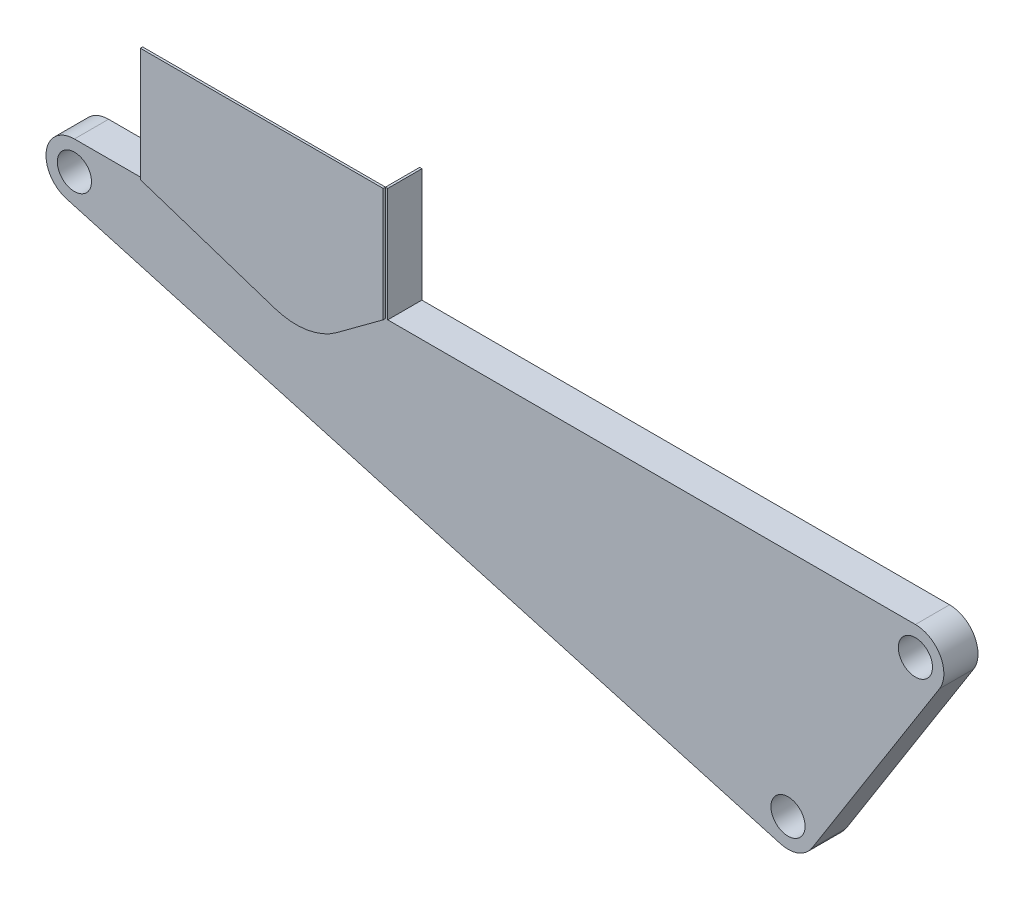
ISO-10303-21;
HEADER;
FILE_DESCRIPTION(('STEP AP214'),'2;1');
FILE_NAME('part.step','',(''),(''),'','','');
FILE_SCHEMA(('AUTOMOTIVE_DESIGN { 1 0 10303 214 1 1 1 1 }'));
ENDSEC;
DATA;
#1=APPLICATION_CONTEXT('core data for automotive mechanical design processes');
#2=APPLICATION_PROTOCOL_DEFINITION('international standard','automotive_design',2000,#1);
#3=PRODUCT_CONTEXT('',#1,'mechanical');
#4=PRODUCT('Part','Part','',(#3));
#5=PRODUCT_RELATED_PRODUCT_CATEGORY('part','',(#4));
#6=PRODUCT_DEFINITION_FORMATION('','',#4);
#7=PRODUCT_DEFINITION_CONTEXT('part definition',#1,'design');
#8=PRODUCT_DEFINITION('design','',#6,#7);
#9=PRODUCT_DEFINITION_SHAPE('','',#8);
#10=(LENGTH_UNIT() NAMED_UNIT(*) SI_UNIT(.MILLI.,.METRE.));
#11=(NAMED_UNIT(*) PLANE_ANGLE_UNIT() SI_UNIT($,.RADIAN.));
#12=(NAMED_UNIT(*) SI_UNIT($,.STERADIAN.) SOLID_ANGLE_UNIT());
#13=UNCERTAINTY_MEASURE_WITH_UNIT(LENGTH_MEASURE(1.E-05),#10,'distance_accuracy_value','');
#14=(GEOMETRIC_REPRESENTATION_CONTEXT(3) GLOBAL_UNCERTAINTY_ASSIGNED_CONTEXT((#13)) GLOBAL_UNIT_ASSIGNED_CONTEXT((#10,
#11,#12)) REPRESENTATION_CONTEXT('',''));
#15=CARTESIAN_POINT('',(0.,0.,0.));
#16=DIRECTION('',(0.,0.,1.));
#17=DIRECTION('',(1.,0.,0.));
#18=AXIS2_PLACEMENT_3D('',#15,#16,#17);
#19=CARTESIAN_POINT('',(2.99251282406907,6.25,0.85));
#20=DIRECTION('',(0.,-1.,0.));
#21=DIRECTION('',(0.,0.,-1.));
#22=AXIS2_PLACEMENT_3D('',#19,#20,#21);
#23=PLANE('',#22);
#24=DIRECTION('',(-1.,0.,0.));
#25=VECTOR('',#24,1.);
#26=CARTESIAN_POINT('',(2.99251282406907,6.25,0.75));
#27=LINE('',#26,#25);
#28=CARTESIAN_POINT('',(13.662279187858,6.25,0.75));
#29=VERTEX_POINT('',#28);
#30=CARTESIAN_POINT('',(2.99251282406907,6.25,0.75));
#31=VERTEX_POINT('',#30);
#32=EDGE_CURVE('E127',#29,#31,#27,.T.);
#33=ORIENTED_EDGE('',*,*,#32,.T.);
#34=DIRECTION('',(0.,0.,-1.));
#35=VECTOR('',#34,1.);
#36=CARTESIAN_POINT('',(2.99251282406907,6.25,0.85));
#37=LINE('',#36,#35);
#38=CARTESIAN_POINT('',(2.99251282406907,6.25,0.85));
#39=VERTEX_POINT('',#38);
#40=EDGE_CURVE('E12',#39,#31,#37,.T.);
#41=ORIENTED_EDGE('',*,*,#40,.F.);
#42=DIRECTION('',(-1.,0.,0.));
#43=VECTOR('',#42,1.);
#44=CARTESIAN_POINT('',(2.99251282406907,6.25,0.85));
#45=LINE('',#44,#43);
#46=CARTESIAN_POINT('',(13.662279187858,6.25,0.85));
#47=VERTEX_POINT('',#46);
#48=EDGE_CURVE('E137',#47,#39,#45,.T.);
#49=ORIENTED_EDGE('',*,*,#48,.F.);
#50=DIRECTION('',(0.,0.,-1.));
#51=VECTOR('',#50,1.);
#52=CARTESIAN_POINT('',(13.662279187858,6.25,0.85));
#53=LINE('',#52,#51);
#54=EDGE_CURVE('E123',#47,#29,#53,.T.);
#55=ORIENTED_EDGE('',*,*,#54,.T.);
#56=EDGE_LOOP('',(#33,#41,#49,#55));
#57=FACE_BOUND('',#56,.T.);
#58=ADVANCED_FACE('F43',(#57),#23,.F.);
#59=CARTESIAN_POINT('',(2.99251282406907,1.25,0.85));
#60=DIRECTION('',(1.,0.,0.));
#61=DIRECTION('',(0.,0.,-1.));
#62=AXIS2_PLACEMENT_3D('',#59,#60,#61);
#63=PLANE('',#62);
#64=DIRECTION('',(0.,-1.,0.));
#65=VECTOR('',#64,1.);
#66=CARTESIAN_POINT('',(2.99251282406907,1.25,0.75));
#67=LINE('',#66,#65);
#68=CARTESIAN_POINT('',(2.99251282406907,1.25,0.75));
#69=VERTEX_POINT('',#68);
#70=EDGE_CURVE('E130',#31,#69,#67,.T.);
#71=ORIENTED_EDGE('',*,*,#70,.T.);
#72=DIRECTION('',(0.,0.,-1.));
#73=VECTOR('',#72,1.);
#74=CARTESIAN_POINT('',(2.99251282406907,1.25,0.85));
#75=LINE('',#74,#73);
#76=CARTESIAN_POINT('',(2.99251282406907,1.25,0.85));
#77=VERTEX_POINT('',#76);
#78=EDGE_CURVE('E51',#77,#69,#75,.T.);
#79=ORIENTED_EDGE('',*,*,#78,.F.);
#80=DIRECTION('',(0.,-1.,0.));
#81=VECTOR('',#80,1.);
#82=CARTESIAN_POINT('',(2.99251282406907,1.25,0.85));
#83=LINE('',#82,#81);
#84=EDGE_CURVE('E96',#39,#77,#83,.T.);
#85=ORIENTED_EDGE('',*,*,#84,.F.);
#86=ORIENTED_EDGE('',*,*,#40,.T.);
#87=EDGE_LOOP('',(#71,#79,#85,#86));
#88=FACE_BOUND('',#87,.T.);
#89=ADVANCED_FACE('F161',(#88),#63,.F.);
#90=CARTESIAN_POINT('',(2.99251282406907,1.25,0.85));
#91=DIRECTION('',(0.312441860567926,0.949936884095387,0.));
#92=DIRECTION('',(-0.949936884095387,0.312441860567926,0.));
#93=AXIS2_PLACEMENT_3D('',#90,#91,#92);
#94=PLANE('',#93);
#95=DIRECTION('',(0.949936884095387,-0.312441860567926,0.));
#96=VECTOR('',#95,1.);
#97=CARTESIAN_POINT('',(2.99251282406907,1.25,0.75));
#98=LINE('',#97,#96);
#99=CARTESIAN_POINT('',(8.9009014853527,-0.693316421540829,0.75));
#100=VERTEX_POINT('',#99);
#101=EDGE_CURVE('E132',#69,#100,#98,.T.);
#102=ORIENTED_EDGE('',*,*,#101,.T.);
#103=DIRECTION('',(0.,0.,-1.));
#104=VECTOR('',#103,1.);
#105=CARTESIAN_POINT('',(8.9009014853527,-0.693316421540829,0.85));
#106=LINE('',#105,#104);
#107=CARTESIAN_POINT('',(8.9009014853527,-0.693316421540829,0.85));
#108=VERTEX_POINT('',#107);
#109=EDGE_CURVE('E118',#108,#100,#106,.T.);
#110=ORIENTED_EDGE('',*,*,#109,.F.);
#111=DIRECTION('',(0.949936884095387,-0.312441860567926,0.));
#112=VECTOR('',#111,1.);
#113=CARTESIAN_POINT('',(2.99251282406907,1.25,0.85));
#114=LINE('',#113,#112);
#115=EDGE_CURVE('E109',#77,#108,#114,.T.);
#116=ORIENTED_EDGE('',*,*,#115,.F.);
#117=ORIENTED_EDGE('',*,*,#78,.T.);
#118=EDGE_LOOP('',(#102,#110,#116,#117));
#119=FACE_BOUND('',#118,.T.);
#120=ADVANCED_FACE('F143',(#119),#94,.F.);
#121=CARTESIAN_POINT('',(9.83822706705649,2.15649423074533,0.85));
#122=DIRECTION('',(0.,0.,-1.));
#123=DIRECTION('',(-1.,0.,0.));
#124=AXIS2_PLACEMENT_3D('',#121,#122,#123);
#125=CYLINDRICAL_SURFACE('',#124,3.);
#126=CARTESIAN_POINT('',(9.83822706705649,2.15649423074533,0.75));
#127=DIRECTION('',(0.,0.,1.));
#128=DIRECTION('',(1.,0.,0.));
#129=AXIS2_PLACEMENT_3D('',#126,#127,#128);
#130=CIRCLE('',#129,3.);
#131=CARTESIAN_POINT('',(11.6195330295032,-0.257413196674294,0.75));
#132=VERTEX_POINT('',#131);
#133=EDGE_CURVE('E117',#100,#132,#130,.T.);
#134=ORIENTED_EDGE('',*,*,#133,.T.);
#135=DIRECTION('',(0.,0.,-1.));
#136=VECTOR('',#135,1.);
#137=CARTESIAN_POINT('',(11.6195330295032,-0.257413196674294,0.85));
#138=LINE('',#137,#136);
#139=CARTESIAN_POINT('',(11.6195330295032,-0.257413196674294,0.85));
#140=VERTEX_POINT('',#139);
#141=EDGE_CURVE('E114',#140,#132,#138,.T.);
#142=ORIENTED_EDGE('',*,*,#141,.F.);
#143=CARTESIAN_POINT('',(9.83822706705649,2.15649423074533,0.85));
#144=DIRECTION('',(0.,0.,1.));
#145=DIRECTION('',(1.,0.,0.));
#146=AXIS2_PLACEMENT_3D('',#143,#144,#145);
#147=CIRCLE('',#146,3.);
#148=EDGE_CURVE('E103',#108,#140,#147,.T.);
#149=ORIENTED_EDGE('',*,*,#148,.F.);
#150=ORIENTED_EDGE('',*,*,#109,.T.);
#151=EDGE_LOOP('',(#134,#142,#149,#150));
#152=FACE_BOUND('',#151,.T.);
#153=ADVANCED_FACE('F115',(#152),#125,.T.);
#154=CARTESIAN_POINT('',(11.6195330295032,-0.257413196674294,0.85));
#155=DIRECTION('',(-0.593768654148917,0.804635809139877,0.));
#156=DIRECTION('',(-0.804635809139877,-0.593768654148917,0.));
#157=AXIS2_PLACEMENT_3D('',#154,#155,#156);
#158=PLANE('',#157);
#159=DIRECTION('',(0.804635809139877,0.593768654148917,0.));
#160=VECTOR('',#159,1.);
#161=CARTESIAN_POINT('',(11.6195330295032,-0.257413196674294,0.75));
#162=LINE('',#161,#160);
#163=CARTESIAN_POINT('',(13.662279187858,1.25,0.75));
#164=VERTEX_POINT('',#163);
#165=EDGE_CURVE('E82',#132,#164,#162,.T.);
#166=ORIENTED_EDGE('',*,*,#165,.T.);
#167=DIRECTION('',(0.,0.,-1.));
#168=VECTOR('',#167,1.);
#169=CARTESIAN_POINT('',(13.662279187858,1.25,0.85));
#170=LINE('',#169,#168);
#171=CARTESIAN_POINT('',(13.662279187858,1.25,0.85));
#172=VERTEX_POINT('',#171);
#173=EDGE_CURVE('E119',#172,#164,#170,.T.);
#174=ORIENTED_EDGE('',*,*,#173,.F.);
#175=DIRECTION('',(0.804635809139877,0.593768654148917,0.));
#176=VECTOR('',#175,1.);
#177=CARTESIAN_POINT('',(11.6195330295032,-0.257413196674294,0.85));
#178=LINE('',#177,#176);
#179=EDGE_CURVE('E107',#140,#172,#178,.T.);
#180=ORIENTED_EDGE('',*,*,#179,.F.);
#181=ORIENTED_EDGE('',*,*,#141,.T.);
#182=EDGE_LOOP('',(#166,#174,#180,#181));
#183=FACE_BOUND('',#182,.T.);
#184=ADVANCED_FACE('F121',(#183),#158,.F.);
#185=CARTESIAN_POINT('',(13.662279187858,6.25,0.85));
#186=DIRECTION('',(-1.,0.,0.));
#187=DIRECTION('',(0.,0.,1.));
#188=AXIS2_PLACEMENT_3D('',#185,#186,#187);
#189=PLANE('',#188);
#190=DIRECTION('',(0.,1.,0.));
#191=VECTOR('',#190,1.);
#192=CARTESIAN_POINT('',(13.662279187858,6.25,0.75));
#193=LINE('',#192,#191);
#194=EDGE_CURVE('E88',#164,#29,#193,.T.);
#195=ORIENTED_EDGE('',*,*,#194,.T.);
#196=ORIENTED_EDGE('',*,*,#54,.F.);
#197=DIRECTION('',(0.,1.,0.));
#198=VECTOR('',#197,1.);
#199=CARTESIAN_POINT('',(13.662279187858,6.25,0.85));
#200=LINE('',#199,#198);
#201=EDGE_CURVE('E59',#172,#47,#200,.T.);
#202=ORIENTED_EDGE('',*,*,#201,.F.);
#203=ORIENTED_EDGE('',*,*,#173,.T.);
#204=EDGE_LOOP('',(#195,#196,#202,#203));
#205=FACE_BOUND('',#204,.T.);
#206=ADVANCED_FACE('F150',(#205),#189,.F.);
#207=CARTESIAN_POINT('',(9.83822706705649,2.15649423074533,0.85));
#208=DIRECTION('',(0.,0.,1.));
#209=DIRECTION('',(1.,0.,0.));
#210=AXIS2_PLACEMENT_3D('',#207,#208,#209);
#211=PLANE('',#210);
#212=ORIENTED_EDGE('',*,*,#48,.T.);
#213=ORIENTED_EDGE('',*,*,#84,.T.);
#214=ORIENTED_EDGE('',*,*,#115,.T.);
#215=ORIENTED_EDGE('',*,*,#148,.T.);
#216=ORIENTED_EDGE('',*,*,#179,.T.);
#217=ORIENTED_EDGE('',*,*,#201,.T.);
#218=EDGE_LOOP('',(#212,#213,#214,#215,#216,#217));
#219=FACE_BOUND('',#218,.T.);
#220=ADVANCED_FACE('F105',(#219),#211,.T.);
#221=CARTESIAN_POINT('',(9.83822706705649,2.15649423074533,0.75));
#222=DIRECTION('',(0.,0.,1.));
#223=DIRECTION('',(1.,0.,0.));
#224=AXIS2_PLACEMENT_3D('',#221,#222,#223);
#225=PLANE('',#224);
#226=ORIENTED_EDGE('',*,*,#32,.F.);
#227=ORIENTED_EDGE('',*,*,#194,.F.);
#228=ORIENTED_EDGE('',*,*,#165,.F.);
#229=ORIENTED_EDGE('',*,*,#133,.F.);
#230=ORIENTED_EDGE('',*,*,#101,.F.);
#231=ORIENTED_EDGE('',*,*,#70,.F.);
#232=EDGE_LOOP('',(#226,#227,#228,#229,#230,#231));
#233=FACE_BOUND('',#232,.T.);
#234=ADVANCED_FACE('F146',(#233),#225,.F.);
#235=CLOSED_SHELL('',(#58,#89,#120,#153,#184,#206,#220,#234));
#236=MANIFOLD_SOLID_BREP('B2',#235);
#237=CARTESIAN_POINT('',(0.,1.25,0.75));
#238=DIRECTION('',(0.,1.,0.));
#239=DIRECTION('',(0.,0.,1.));
#240=AXIS2_PLACEMENT_3D('',#237,#238,#239);
#241=PLANE('',#240);
#242=DIRECTION('',(1.,0.,0.));
#243=VECTOR('',#242,1.);
#244=CARTESIAN_POINT('',(0.,1.25,-0.75));
#245=LINE('',#244,#243);
#246=CARTESIAN_POINT('',(13.762279187858,1.25,-0.75));
#247=VERTEX_POINT('',#246);
#248=CARTESIAN_POINT('',(36.94,1.25,-0.75));
#249=VERTEX_POINT('',#248);
#250=EDGE_CURVE('E239',#247,#249,#245,.T.);
#251=ORIENTED_EDGE('',*,*,#250,.F.);
#252=DIRECTION('',(0.,0.,-1.));
#253=VECTOR('',#252,1.);
#254=CARTESIAN_POINT('',(13.762279187858,1.25,0.75));
#255=LINE('',#254,#253);
#256=CARTESIAN_POINT('',(13.762279187858,1.25,0.75));
#257=VERTEX_POINT('',#256);
#258=EDGE_CURVE('E234',#257,#247,#255,.T.);
#259=ORIENTED_EDGE('',*,*,#258,.F.);
#260=DIRECTION('',(1.,0.,0.));
#261=VECTOR('',#260,1.);
#262=CARTESIAN_POINT('',(0.,1.25,0.75));
#263=LINE('',#262,#261);
#264=CARTESIAN_POINT('',(36.94,1.25,0.75));
#265=VERTEX_POINT('',#264);
#266=EDGE_CURVE('E383',#257,#265,#263,.T.);
#267=ORIENTED_EDGE('',*,*,#266,.T.);
#268=DIRECTION('',(0.,0.,-1.));
#269=VECTOR('',#268,1.);
#270=CARTESIAN_POINT('',(36.94,1.25,0.75));
#271=LINE('',#270,#269);
#272=EDGE_CURVE('E405',#265,#249,#271,.T.);
#273=ORIENTED_EDGE('',*,*,#272,.T.);
#274=EDGE_LOOP('',(#251,#259,#267,#273));
#275=FACE_BOUND('',#274,.T.);
#276=ADVANCED_FACE('F219',(#275),#241,.T.);
#277=CARTESIAN_POINT('',(0.,0.,0.75));
#278=DIRECTION('',(0.,0.,-1.));
#279=DIRECTION('',(-1.,0.,0.));
#280=AXIS2_PLACEMENT_3D('',#277,#278,#279);
#281=CYLINDRICAL_SURFACE('',#280,1.25);
#282=CARTESIAN_POINT('',(0.,0.,-0.75));
#283=DIRECTION('',(0.,0.,1.));
#284=DIRECTION('',(1.,0.,0.));
#285=AXIS2_PLACEMENT_3D('',#282,#283,#284);
#286=CIRCLE('',#285,1.25);
#287=CARTESIAN_POINT('',(0.,1.25,-0.75));
#288=VERTEX_POINT('',#287);
#289=CARTESIAN_POINT('',(-0.339633960867539,-1.20297496758055,-0.75));
#290=VERTEX_POINT('',#289);
#291=EDGE_CURVE('E388',#288,#290,#286,.T.);
#292=ORIENTED_EDGE('',*,*,#291,.T.);
#293=DIRECTION('',(0.,0.,-1.));
#294=VECTOR('',#293,1.);
#295=CARTESIAN_POINT('',(-0.339633960867539,-1.20297496758055,0.75));
#296=LINE('',#295,#294);
#297=CARTESIAN_POINT('',(-0.339633960867539,-1.20297496758055,0.75));
#298=VERTEX_POINT('',#297);
#299=EDGE_CURVE('E414',#298,#290,#296,.T.);
#300=ORIENTED_EDGE('',*,*,#299,.F.);
#301=CARTESIAN_POINT('',(0.,0.,0.75));
#302=DIRECTION('',(0.,0.,1.));
#303=DIRECTION('',(1.,0.,0.));
#304=AXIS2_PLACEMENT_3D('',#301,#302,#303);
#305=CIRCLE('',#304,1.25);
#306=CARTESIAN_POINT('',(0.,1.25,0.75));
#307=VERTEX_POINT('',#306);
#308=EDGE_CURVE('E369',#307,#298,#305,.T.);
#309=ORIENTED_EDGE('',*,*,#308,.F.);
#310=DIRECTION('',(0.,0.,-1.));
#311=VECTOR('',#310,1.);
#312=CARTESIAN_POINT('',(0.,1.25,0.75));
#313=LINE('',#312,#311);
#314=EDGE_CURVE('E387',#307,#288,#313,.T.);
#315=ORIENTED_EDGE('',*,*,#314,.T.);
#316=EDGE_LOOP('',(#292,#300,#309,#315));
#317=FACE_BOUND('',#316,.T.);
#318=ADVANCED_FACE('F221',(#317),#281,.T.);
#319=CARTESIAN_POINT('',(-0.339633960867539,-1.20297496758055,0.75));
#320=DIRECTION('',(0.271707168694031,0.962379974064441,0.));
#321=DIRECTION('',(-0.962379974064441,0.271707168694031,0.));
#322=AXIS2_PLACEMENT_3D('',#319,#320,#321);
#323=PLANE('',#322);
#324=DIRECTION('',(0.96237997406444,-0.271707168694031,0.));
#325=VECTOR('',#324,1.);
#326=CARTESIAN_POINT('',(-0.339633960867539,-1.20297496758055,-0.75));
#327=LINE('',#326,#325);
#328=CARTESIAN_POINT('',(31.0050817944113,-10.0524774519451,-0.75));
#329=VERTEX_POINT('',#328);
#330=EDGE_CURVE('E391',#290,#329,#327,.T.);
#331=ORIENTED_EDGE('',*,*,#330,.T.);
#332=DIRECTION('',(0.,0.,-1.));
#333=VECTOR('',#332,1.);
#334=CARTESIAN_POINT('',(31.0050817944113,-10.0524774519451,0.75));
#335=LINE('',#334,#333);
#336=CARTESIAN_POINT('',(31.0050817944113,-10.0524774519451,0.75));
#337=VERTEX_POINT('',#336);
#338=EDGE_CURVE('E411',#337,#329,#335,.T.);
#339=ORIENTED_EDGE('',*,*,#338,.F.);
#340=DIRECTION('',(0.96237997406444,-0.271707168694031,0.));
#341=VECTOR('',#340,1.);
#342=CARTESIAN_POINT('',(-0.339633960867539,-1.20297496758055,0.75));
#343=LINE('',#342,#341);
#344=EDGE_CURVE('E372',#298,#337,#343,.T.);
#345=ORIENTED_EDGE('',*,*,#344,.F.);
#346=ORIENTED_EDGE('',*,*,#299,.T.);
#347=EDGE_LOOP('',(#331,#339,#345,#346));
#348=FACE_BOUND('',#347,.T.);
#349=ADVANCED_FACE('F451',(#348),#323,.F.);
#350=CARTESIAN_POINT('',(31.3447157552788,-8.84950248436459,0.75));
#351=DIRECTION('',(0.,0.,-1.));
#352=DIRECTION('',(-1.,0.,0.));
#353=AXIS2_PLACEMENT_3D('',#350,#351,#352);
#354=CYLINDRICAL_SURFACE('',#353,1.25000000000001);
#355=CARTESIAN_POINT('',(31.3447157552788,-8.84950248436459,-0.75));
#356=DIRECTION('',(0.,0.,1.));
#357=DIRECTION('',(1.,0.,0.));
#358=AXIS2_PLACEMENT_3D('',#355,#356,#357);
#359=CIRCLE('',#358,1.25000000000001);
#360=CARTESIAN_POINT('',(32.4012466153988,-9.51751636267419,-0.75));
#361=VERTEX_POINT('',#360);
#362=EDGE_CURVE('E393',#329,#361,#359,.T.);
#363=ORIENTED_EDGE('',*,*,#362,.T.);
#364=DIRECTION('',(0.,0.,-1.));
#365=VECTOR('',#364,1.);
#366=CARTESIAN_POINT('',(32.4012466153988,-9.51751636267419,0.75));
#367=LINE('',#366,#365);
#368=CARTESIAN_POINT('',(32.4012466153988,-9.51751636267419,0.75));
#369=VERTEX_POINT('',#368);
#370=EDGE_CURVE('E409',#369,#361,#367,.T.);
#371=ORIENTED_EDGE('',*,*,#370,.F.);
#372=CARTESIAN_POINT('',(31.3447157552788,-8.84950248436459,0.75));
#373=DIRECTION('',(0.,0.,1.));
#374=DIRECTION('',(1.,0.,0.));
#375=AXIS2_PLACEMENT_3D('',#372,#373,#374);
#376=CIRCLE('',#375,1.25000000000001);
#377=EDGE_CURVE('E375',#337,#369,#376,.T.);
#378=ORIENTED_EDGE('',*,*,#377,.F.);
#379=ORIENTED_EDGE('',*,*,#338,.T.);
#380=EDGE_LOOP('',(#363,#371,#378,#379));
#381=FACE_BOUND('',#380,.T.);
#382=ADVANCED_FACE('F454',(#381),#354,.T.);
#383=CARTESIAN_POINT('',(37.9965308601199,-0.668013878309598,0.75));
#384=DIRECTION('',(0.84522468809595,-0.534411102647676,0.));
#385=DIRECTION('',(0.534411102647676,0.84522468809595,0.));
#386=AXIS2_PLACEMENT_3D('',#383,#384,#385);
#387=PLANE('',#386);
#388=DIRECTION('',(-0.534411102647676,-0.84522468809595,0.));
#389=VECTOR('',#388,1.);
#390=CARTESIAN_POINT('',(37.9965308601199,-0.668013878309598,-0.75));
#391=LINE('',#390,#389);
#392=CARTESIAN_POINT('',(37.9965308601199,-0.668013878309596,-0.75));
#393=VERTEX_POINT('',#392);
#394=EDGE_CURVE('E396',#393,#361,#391,.T.);
#395=ORIENTED_EDGE('',*,*,#394,.F.);
#396=DIRECTION('',(0.,0.,-1.));
#397=VECTOR('',#396,1.);
#398=CARTESIAN_POINT('',(37.9965308601199,-0.668013878309596,0.75));
#399=LINE('',#398,#397);
#400=CARTESIAN_POINT('',(37.9965308601199,-0.668013878309596,0.75));
#401=VERTEX_POINT('',#400);
#402=EDGE_CURVE('E407',#401,#393,#399,.T.);
#403=ORIENTED_EDGE('',*,*,#402,.F.);
#404=DIRECTION('',(-0.534411102647676,-0.84522468809595,0.));
#405=VECTOR('',#404,1.);
#406=CARTESIAN_POINT('',(37.9965308601199,-0.668013878309598,0.75));
#407=LINE('',#406,#405);
#408=EDGE_CURVE('E377',#401,#369,#407,.T.);
#409=ORIENTED_EDGE('',*,*,#408,.T.);
#410=ORIENTED_EDGE('',*,*,#370,.T.);
#411=EDGE_LOOP('',(#395,#403,#409,#410));
#412=FACE_BOUND('',#411,.T.);
#413=ADVANCED_FACE('F457',(#412),#387,.T.);
#414=CARTESIAN_POINT('',(36.94,0.,0.75));
#415=DIRECTION('',(0.,0.,-1.));
#416=DIRECTION('',(-1.,0.,0.));
#417=AXIS2_PLACEMENT_3D('',#414,#415,#416);
#418=CYLINDRICAL_SURFACE('',#417,1.25);
#419=CARTESIAN_POINT('',(36.94,0.,-0.75));
#420=DIRECTION('',(0.,0.,1.));
#421=DIRECTION('',(1.,0.,0.));
#422=AXIS2_PLACEMENT_3D('',#419,#420,#421);
#423=CIRCLE('',#422,1.25);
#424=EDGE_CURVE('E399',#393,#249,#423,.T.);
#425=ORIENTED_EDGE('',*,*,#424,.T.);
#426=ORIENTED_EDGE('',*,*,#272,.F.);
#427=CARTESIAN_POINT('',(36.94,0.,0.75));
#428=DIRECTION('',(0.,0.,1.));
#429=DIRECTION('',(1.,0.,0.));
#430=AXIS2_PLACEMENT_3D('',#427,#428,#429);
#431=CIRCLE('',#430,1.25);
#432=EDGE_CURVE('E380',#401,#265,#431,.T.);
#433=ORIENTED_EDGE('',*,*,#432,.F.);
#434=ORIENTED_EDGE('',*,*,#402,.T.);
#435=EDGE_LOOP('',(#425,#426,#433,#434));
#436=FACE_BOUND('',#435,.T.);
#437=ADVANCED_FACE('F461',(#436),#418,.T.);
#438=DIRECTION('',(0.,0.,1.));
#439=VECTOR('',#438,1.);
#440=CARTESIAN_POINT('',(2.99251282406907,1.25,-9.25));
#441=LINE('',#440,#439);
#442=CARTESIAN_POINT('',(2.99251282406907,1.25,-0.750000000000001));
#443=VERTEX_POINT('',#442);
#444=CARTESIAN_POINT('',(2.99251282406907,1.25,0.75));
#445=VERTEX_POINT('',#444);
#446=EDGE_CURVE('E350',#443,#445,#441,.T.);
#447=ORIENTED_EDGE('',*,*,#446,.F.);
#448=EDGE_CURVE('E373',#288,#443,#245,.T.);
#449=ORIENTED_EDGE('',*,*,#448,.F.);
#450=ORIENTED_EDGE('',*,*,#314,.F.);
#451=EDGE_CURVE('E384',#307,#445,#263,.T.);
#452=ORIENTED_EDGE('',*,*,#451,.T.);
#453=EDGE_LOOP('',(#447,#449,#450,#452));
#454=FACE_BOUND('',#453,.T.);
#455=ADVANCED_FACE('F440',(#454),#241,.T.);
#456=CARTESIAN_POINT('',(0.,0.,0.75));
#457=DIRECTION('',(0.,0.,1.));
#458=DIRECTION('',(1.,0.,0.));
#459=AXIS2_PLACEMENT_3D('',#456,#457,#458);
#460=PLANE('',#459);
#461=DIRECTION('',(0.804635809139877,0.593768654148917,0.));
#462=VECTOR('',#461,1.);
#463=CARTESIAN_POINT('',(11.6195330295032,-0.257413196674294,0.75));
#464=LINE('',#463,#462);
#465=CARTESIAN_POINT('',(11.6195330295032,-0.257413196674294,0.75));
#466=VERTEX_POINT('',#465);
#467=CARTESIAN_POINT('',(13.662279187858,1.25,0.75));
#468=VERTEX_POINT('',#467);
#469=EDGE_CURVE('E348',#466,#468,#464,.T.);
#470=ORIENTED_EDGE('',*,*,#469,.F.);
#471=CARTESIAN_POINT('',(9.83822706705649,2.15649423074533,0.75));
#472=DIRECTION('',(0.,0.,1.));
#473=DIRECTION('',(1.,0.,0.));
#474=AXIS2_PLACEMENT_3D('',#471,#472,#473);
#475=CIRCLE('',#474,3.);
#476=CARTESIAN_POINT('',(8.9009014853527,-0.693316421540829,0.75));
#477=VERTEX_POINT('',#476);
#478=EDGE_CURVE('E340',#477,#466,#475,.T.);
#479=ORIENTED_EDGE('',*,*,#478,.F.);
#480=DIRECTION('',(0.949936884095387,-0.312441860567926,0.));
#481=VECTOR('',#480,1.);
#482=CARTESIAN_POINT('',(2.99251282406907,1.25,0.75));
#483=LINE('',#482,#481);
#484=EDGE_CURVE('E337',#445,#477,#483,.T.);
#485=ORIENTED_EDGE('',*,*,#484,.F.);
#486=ORIENTED_EDGE('',*,*,#451,.F.);
#487=ORIENTED_EDGE('',*,*,#308,.T.);
#488=ORIENTED_EDGE('',*,*,#344,.T.);
#489=ORIENTED_EDGE('',*,*,#377,.T.);
#490=ORIENTED_EDGE('',*,*,#408,.F.);
#491=ORIENTED_EDGE('',*,*,#432,.T.);
#492=ORIENTED_EDGE('',*,*,#266,.F.);
#493=DIRECTION('',(0.,-1.,0.));
#494=VECTOR('',#493,1.);
#495=CARTESIAN_POINT('',(13.762279187858,6.25,0.75));
#496=LINE('',#495,#494);
#497=CARTESIAN_POINT('',(13.762279187858,6.25,0.75));
#498=VERTEX_POINT('',#497);
#499=EDGE_CURVE('E321',#498,#257,#496,.T.);
#500=ORIENTED_EDGE('',*,*,#499,.F.);
#501=DIRECTION('',(1.,0.,0.));
#502=VECTOR('',#501,1.);
#503=CARTESIAN_POINT('',(13.662279187858,6.25,0.75));
#504=LINE('',#503,#502);
#505=CARTESIAN_POINT('',(13.662279187858,6.25,0.75));
#506=VERTEX_POINT('',#505);
#507=EDGE_CURVE('E312',#506,#498,#504,.T.);
#508=ORIENTED_EDGE('',*,*,#507,.F.);
#509=DIRECTION('',(0.,-1.,0.));
#510=VECTOR('',#509,1.);
#511=CARTESIAN_POINT('',(13.662279187858,6.25,0.75));
#512=LINE('',#511,#510);
#513=EDGE_CURVE('E318',#506,#468,#512,.T.);
#514=ORIENTED_EDGE('',*,*,#513,.T.);
#515=EDGE_LOOP('',(#470,#479,#485,#486,#487,#488,#489,#490,#491,#492,#500,#508,#514));
#516=FACE_BOUND('',#515,.T.);
#517=CARTESIAN_POINT('',(36.94,0.,0.75));
#518=DIRECTION('',(0.,0.,1.));
#519=DIRECTION('',(1.,0.,0.));
#520=AXIS2_PLACEMENT_3D('',#517,#518,#519);
#521=CIRCLE('',#520,0.749999999999999);
#522=CARTESIAN_POINT('',(37.69,0.,0.75));
#523=VERTEX_POINT('',#522);
#524=EDGE_CURVE('E358',#523,#523,#521,.T.);
#525=ORIENTED_EDGE('',*,*,#524,.F.);
#526=EDGE_LOOP('',(#525));
#527=FACE_BOUND('',#526,.T.);
#528=CARTESIAN_POINT('',(0.,0.,0.75));
#529=DIRECTION('',(0.,0.,1.));
#530=DIRECTION('',(1.,0.,0.));
#531=AXIS2_PLACEMENT_3D('',#528,#529,#530);
#532=CIRCLE('',#531,0.75);
#533=CARTESIAN_POINT('',(0.75,0.,0.75));
#534=VERTEX_POINT('',#533);
#535=EDGE_CURVE('E352',#534,#534,#532,.T.);
#536=ORIENTED_EDGE('',*,*,#535,.F.);
#537=EDGE_LOOP('',(#536));
#538=FACE_BOUND('',#537,.T.);
#539=CARTESIAN_POINT('',(31.3447157552788,-8.84950248436459,0.75));
#540=DIRECTION('',(0.,0.,1.));
#541=DIRECTION('',(1.,0.,0.));
#542=AXIS2_PLACEMENT_3D('',#539,#540,#541);
#543=CIRCLE('',#542,0.749999999999999);
#544=CARTESIAN_POINT('',(32.0947157552788,-8.84950248436459,0.75));
#545=VERTEX_POINT('',#544);
#546=EDGE_CURVE('E364',#545,#545,#543,.T.);
#547=ORIENTED_EDGE('',*,*,#546,.F.);
#548=EDGE_LOOP('',(#547));
#549=FACE_BOUND('',#548,.T.);
#550=ADVANCED_FACE('F315',(#516,#527,#538,#549),#460,.T.);
#551=CARTESIAN_POINT('',(0.,0.,-0.75));
#552=DIRECTION('',(0.,0.,1.));
#553=DIRECTION('',(1.,0.,0.));
#554=AXIS2_PLACEMENT_3D('',#551,#552,#553);
#555=PLANE('',#554);
#556=CARTESIAN_POINT('',(36.94,0.,-0.750000000000001));
#557=DIRECTION('',(0.,0.,1.));
#558=DIRECTION('',(1.,0.,0.));
#559=AXIS2_PLACEMENT_3D('',#556,#557,#558);
#560=CIRCLE('',#559,0.749999999999999);
#561=CARTESIAN_POINT('',(37.69,0.,-0.750000000000001));
#562=VERTEX_POINT('',#561);
#563=EDGE_CURVE('E368',#562,#562,#560,.T.);
#564=ORIENTED_EDGE('',*,*,#563,.T.);
#565=EDGE_LOOP('',(#564));
#566=FACE_BOUND('',#565,.T.);
#567=CARTESIAN_POINT('',(0.,0.,-0.750000000000001));
#568=DIRECTION('',(0.,0.,1.));
#569=DIRECTION('',(1.,0.,0.));
#570=AXIS2_PLACEMENT_3D('',#567,#568,#569);
#571=CIRCLE('',#570,0.75);
#572=CARTESIAN_POINT('',(0.75,0.,-0.750000000000001));
#573=VERTEX_POINT('',#572);
#574=EDGE_CURVE('E361',#573,#573,#571,.T.);
#575=ORIENTED_EDGE('',*,*,#574,.T.);
#576=EDGE_LOOP('',(#575));
#577=FACE_BOUND('',#576,.T.);
#578=CARTESIAN_POINT('',(31.3447157552788,-8.84950248436459,-0.750000000000001));
#579=DIRECTION('',(0.,0.,1.));
#580=DIRECTION('',(1.,0.,0.));
#581=AXIS2_PLACEMENT_3D('',#578,#579,#580);
#582=CIRCLE('',#581,0.749999999999999);
#583=CARTESIAN_POINT('',(32.0947157552788,-8.84950248436459,-0.750000000000001));
#584=VERTEX_POINT('',#583);
#585=EDGE_CURVE('E367',#584,#584,#582,.T.);
#586=ORIENTED_EDGE('',*,*,#585,.T.);
#587=EDGE_LOOP('',(#586));
#588=FACE_BOUND('',#587,.T.);
#589=CARTESIAN_POINT('',(9.83822706705649,2.15649423074533,-0.750000000000001));
#590=DIRECTION('',(0.,0.,1.));
#591=DIRECTION('',(1.,0.,0.));
#592=AXIS2_PLACEMENT_3D('',#589,#590,#591);
#593=CIRCLE('',#592,3.);
#594=CARTESIAN_POINT('',(8.9009014853527,-0.693316421540829,-0.75));
#595=VERTEX_POINT('',#594);
#596=CARTESIAN_POINT('',(11.6195330295032,-0.257413196674294,-0.750000000000001));
#597=VERTEX_POINT('',#596);
#598=EDGE_CURVE('E227',#595,#597,#593,.T.);
#599=ORIENTED_EDGE('',*,*,#598,.T.);
#600=DIRECTION('',(0.804635809139877,0.593768654148916,0.));
#601=VECTOR('',#600,1.);
#602=CARTESIAN_POINT('',(4.21958034351484,-5.71809478356745,-0.75));
#603=LINE('',#602,#601);
#604=CARTESIAN_POINT('',(13.662279187858,1.25,-0.750000000000001));
#605=VERTEX_POINT('',#604);
#606=EDGE_CURVE('E41',#597,#605,#603,.T.);
#607=ORIENTED_EDGE('',*,*,#606,.T.);
#608=DIRECTION('',(0.,-1.,0.));
#609=VECTOR('',#608,1.);
#610=CARTESIAN_POINT('',(13.662279187858,6.25,-0.750000000000001));
#611=LINE('',#610,#609);
#612=CARTESIAN_POINT('',(13.662279187858,6.25,-0.750000000000001));
#613=VERTEX_POINT('',#612);
#614=EDGE_CURVE('E611',#613,#605,#611,.T.);
#615=ORIENTED_EDGE('',*,*,#614,.F.);
#616=DIRECTION('',(-1.,0.,0.));
#617=VECTOR('',#616,1.);
#618=CARTESIAN_POINT('',(13.662279187858,6.25,-0.750000000000001));
#619=LINE('',#618,#617);
#620=CARTESIAN_POINT('',(13.762279187858,6.25,-0.750000000000001));
#621=VERTEX_POINT('',#620);
#622=EDGE_CURVE('E330',#621,#613,#619,.T.);
#623=ORIENTED_EDGE('',*,*,#622,.F.);
#624=DIRECTION('',(0.,-1.,0.));
#625=VECTOR('',#624,1.);
#626=CARTESIAN_POINT('',(13.762279187858,6.25,-0.750000000000001));
#627=LINE('',#626,#625);
#628=EDGE_CURVE('E342',#621,#247,#627,.T.);
#629=ORIENTED_EDGE('',*,*,#628,.T.);
#630=ORIENTED_EDGE('',*,*,#250,.T.);
#631=ORIENTED_EDGE('',*,*,#424,.F.);
#632=ORIENTED_EDGE('',*,*,#394,.T.);
#633=ORIENTED_EDGE('',*,*,#362,.F.);
#634=ORIENTED_EDGE('',*,*,#330,.F.);
#635=ORIENTED_EDGE('',*,*,#291,.F.);
#636=ORIENTED_EDGE('',*,*,#448,.T.);
#637=DIRECTION('',(0.949936884095387,-0.312441860567926,0.));
#638=VECTOR('',#637,1.);
#639=CARTESIAN_POINT('',(0.663128910579301,2.01615305300079,-0.75));
#640=LINE('',#639,#638);
#641=EDGE_CURVE('E417',#443,#595,#640,.T.);
#642=ORIENTED_EDGE('',*,*,#641,.T.);
#643=EDGE_LOOP('',(#599,#607,#615,#623,#629,#630,#631,#632,#633,#634,#635,#636,#642));
#644=FACE_BOUND('',#643,.T.);
#645=ADVANCED_FACE('F428',(#566,#577,#588,#644),#555,.F.);
#646=CARTESIAN_POINT('',(31.3447157552788,-8.84950248436459,-10.75));
#647=DIRECTION('',(0.,0.,1.));
#648=DIRECTION('',(1.,0.,0.));
#649=AXIS2_PLACEMENT_3D('',#646,#647,#648);
#650=CYLINDRICAL_SURFACE('',#649,0.749999999999999);
#651=ORIENTED_EDGE('',*,*,#546,.T.);
#652=EDGE_LOOP('',(#651));
#653=FACE_BOUND('',#652,.T.);
#654=ORIENTED_EDGE('',*,*,#585,.F.);
#655=EDGE_LOOP('',(#654));
#656=FACE_BOUND('',#655,.T.);
#657=ADVANCED_FACE('F509',(#653,#656),#650,.F.);
#658=CARTESIAN_POINT('',(0.,0.,-10.75));
#659=DIRECTION('',(0.,0.,1.));
#660=DIRECTION('',(1.,0.,0.));
#661=AXIS2_PLACEMENT_3D('',#658,#659,#660);
#662=CYLINDRICAL_SURFACE('',#661,0.75);
#663=ORIENTED_EDGE('',*,*,#535,.T.);
#664=EDGE_LOOP('',(#663));
#665=FACE_BOUND('',#664,.T.);
#666=ORIENTED_EDGE('',*,*,#574,.F.);
#667=EDGE_LOOP('',(#666));
#668=FACE_BOUND('',#667,.T.);
#669=ADVANCED_FACE('F514',(#665,#668),#662,.F.);
#670=CARTESIAN_POINT('',(36.94,0.,-10.75));
#671=DIRECTION('',(0.,0.,1.));
#672=DIRECTION('',(1.,0.,0.));
#673=AXIS2_PLACEMENT_3D('',#670,#671,#672);
#674=CYLINDRICAL_SURFACE('',#673,0.749999999999999);
#675=ORIENTED_EDGE('',*,*,#524,.T.);
#676=EDGE_LOOP('',(#675));
#677=FACE_BOUND('',#676,.T.);
#678=ORIENTED_EDGE('',*,*,#563,.F.);
#679=EDGE_LOOP('',(#678));
#680=FACE_BOUND('',#679,.T.);
#681=ADVANCED_FACE('F524',(#677,#680),#674,.F.);
#682=CARTESIAN_POINT('',(11.6195330295032,-0.257413196674294,-9.25));
#683=DIRECTION('',(0.593768654148916,-0.804635809139877,0.));
#684=DIRECTION('',(0.804635809139877,0.593768654148916,0.));
#685=AXIS2_PLACEMENT_3D('',#682,#683,#684);
#686=PLANE('',#685);
#687=DIRECTION('',(0.,0.,1.));
#688=VECTOR('',#687,1.);
#689=CARTESIAN_POINT('',(11.6195330295032,-0.257413196674294,-9.25));
#690=LINE('',#689,#688);
#691=EDGE_CURVE('E353',#597,#466,#690,.T.);
#692=ORIENTED_EDGE('',*,*,#691,.T.);
#693=ORIENTED_EDGE('',*,*,#469,.T.);
#694=DIRECTION('',(0.,0.,1.));
#695=VECTOR('',#694,1.);
#696=CARTESIAN_POINT('',(13.662279187858,1.25,-9.25));
#697=LINE('',#696,#695);
#698=EDGE_CURVE('E336',#605,#468,#697,.T.);
#699=ORIENTED_EDGE('',*,*,#698,.F.);
#700=ORIENTED_EDGE('',*,*,#606,.F.);
#701=EDGE_LOOP('',(#692,#693,#699,#700));
#702=FACE_BOUND('',#701,.T.);
#703=ADVANCED_FACE('F434',(#702),#686,.F.);
#704=CARTESIAN_POINT('',(9.83822706705649,2.15649423074533,-9.25));
#705=DIRECTION('',(0.,0.,1.));
#706=DIRECTION('',(1.,0.,0.));
#707=AXIS2_PLACEMENT_3D('',#704,#705,#706);
#708=CYLINDRICAL_SURFACE('',#707,3.);
#709=DIRECTION('',(0.,0.,1.));
#710=VECTOR('',#709,1.);
#711=CARTESIAN_POINT('',(8.9009014853527,-0.693316421540829,-9.25));
#712=LINE('',#711,#710);
#713=EDGE_CURVE('E355',#595,#477,#712,.T.);
#714=ORIENTED_EDGE('',*,*,#713,.T.);
#715=ORIENTED_EDGE('',*,*,#478,.T.);
#716=ORIENTED_EDGE('',*,*,#691,.F.);
#717=ORIENTED_EDGE('',*,*,#598,.F.);
#718=EDGE_LOOP('',(#714,#715,#716,#717));
#719=FACE_BOUND('',#718,.T.);
#720=ADVANCED_FACE('F431',(#719),#708,.F.);
#721=CARTESIAN_POINT('',(2.99251282406907,1.25,-9.25));
#722=DIRECTION('',(-0.312441860567926,-0.949936884095387,0.));
#723=DIRECTION('',(0.949936884095387,-0.312441860567926,0.));
#724=AXIS2_PLACEMENT_3D('',#721,#722,#723);
#725=PLANE('',#724);
#726=ORIENTED_EDGE('',*,*,#446,.T.);
#727=ORIENTED_EDGE('',*,*,#484,.T.);
#728=ORIENTED_EDGE('',*,*,#713,.F.);
#729=ORIENTED_EDGE('',*,*,#641,.F.);
#730=EDGE_LOOP('',(#726,#727,#728,#729));
#731=FACE_BOUND('',#730,.T.);
#732=ADVANCED_FACE('F552',(#731),#725,.F.);
#733=CARTESIAN_POINT('',(13.662279187858,6.25,0.75));
#734=DIRECTION('',(1.,0.,0.));
#735=DIRECTION('',(0.,0.,-1.));
#736=AXIS2_PLACEMENT_3D('',#733,#734,#735);
#737=PLANE('',#736);
#738=ORIENTED_EDGE('',*,*,#698,.T.);
#739=ORIENTED_EDGE('',*,*,#513,.F.);
#740=DIRECTION('',(0.,0.,1.));
#741=VECTOR('',#740,1.);
#742=CARTESIAN_POINT('',(13.662279187858,6.25,0.75));
#743=LINE('',#742,#741);
#744=EDGE_CURVE('E325',#613,#506,#743,.T.);
#745=ORIENTED_EDGE('',*,*,#744,.F.);
#746=ORIENTED_EDGE('',*,*,#614,.T.);
#747=EDGE_LOOP('',(#738,#739,#745,#746));
#748=FACE_BOUND('',#747,.T.);
#749=ADVANCED_FACE('F335',(#748),#737,.F.);
#750=CARTESIAN_POINT('',(13.762279187858,6.25,0.75));
#751=DIRECTION('',(-1.,0.,0.));
#752=DIRECTION('',(0.,0.,1.));
#753=AXIS2_PLACEMENT_3D('',#750,#751,#752);
#754=PLANE('',#753);
#755=ORIENTED_EDGE('',*,*,#258,.T.);
#756=ORIENTED_EDGE('',*,*,#628,.F.);
#757=DIRECTION('',(0.,0.,-1.));
#758=VECTOR('',#757,1.);
#759=CARTESIAN_POINT('',(13.762279187858,6.25,0.75));
#760=LINE('',#759,#758);
#761=EDGE_CURVE('E324',#498,#621,#760,.T.);
#762=ORIENTED_EDGE('',*,*,#761,.F.);
#763=ORIENTED_EDGE('',*,*,#499,.T.);
#764=EDGE_LOOP('',(#755,#756,#762,#763));
#765=FACE_BOUND('',#764,.T.);
#766=ADVANCED_FACE('F574',(#765),#754,.F.);
#767=CARTESIAN_POINT('',(0.,6.25,0.));
#768=DIRECTION('',(0.,-1.,0.));
#769=DIRECTION('',(0.,0.,-1.));
#770=AXIS2_PLACEMENT_3D('',#767,#768,#769);
#771=PLANE('',#770);
#772=ORIENTED_EDGE('',*,*,#744,.T.);
#773=ORIENTED_EDGE('',*,*,#507,.T.);
#774=ORIENTED_EDGE('',*,*,#761,.T.);
#775=ORIENTED_EDGE('',*,*,#622,.T.);
#776=EDGE_LOOP('',(#772,#773,#774,#775));
#777=FACE_BOUND('',#776,.T.);
#778=ADVANCED_FACE('F328',(#777),#771,.F.);
#779=CLOSED_SHELL('',(#276,#318,#349,#382,#413,#437,#455,#550,#645,#657,#669,#681,#703,#720,
#732,#749,#766,#778));
#780=MANIFOLD_SOLID_BREP('B6',#779);
#781=ADVANCED_BREP_SHAPE_REPRESENTATION('',(#18,#236,#780),#14);
#782=SHAPE_DEFINITION_REPRESENTATION(#9,#781);
ENDSEC;
END-ISO-10303-21;
